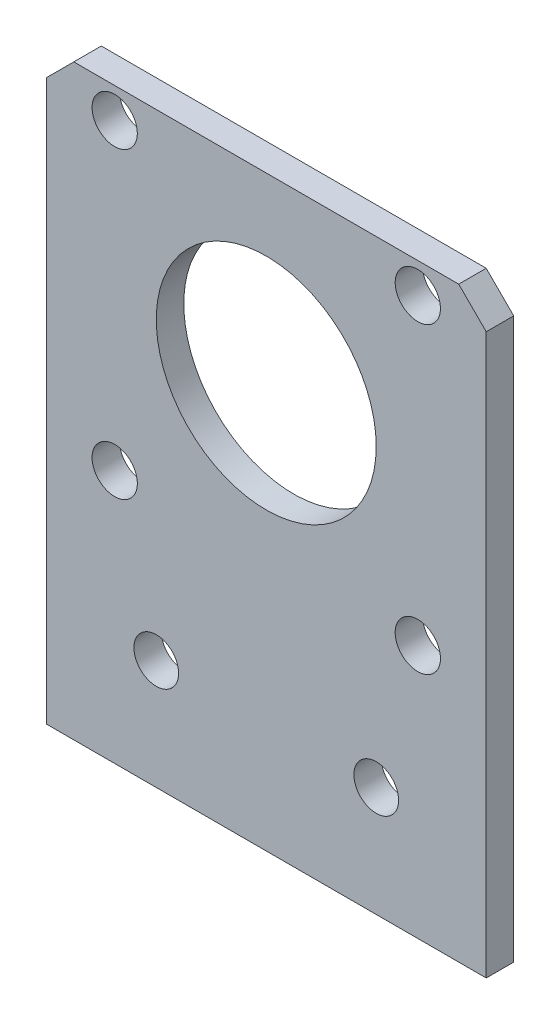
ISO-10303-21;
HEADER;
FILE_DESCRIPTION(('STEP AP214'),'2;1');
FILE_NAME('part.step','',(''),(''),'','','');
FILE_SCHEMA(('AUTOMOTIVE_DESIGN { 1 0 10303 214 1 1 1 1 }'));
ENDSEC;
DATA;
#1=APPLICATION_CONTEXT('core data for automotive mechanical design processes');
#2=APPLICATION_PROTOCOL_DEFINITION('international standard','automotive_design',2000,#1);
#3=PRODUCT_CONTEXT('',#1,'mechanical');
#4=PRODUCT('Part','Part','',(#3));
#5=PRODUCT_RELATED_PRODUCT_CATEGORY('part','',(#4));
#6=PRODUCT_DEFINITION_FORMATION('','',#4);
#7=PRODUCT_DEFINITION_CONTEXT('part definition',#1,'design');
#8=PRODUCT_DEFINITION('design','',#6,#7);
#9=PRODUCT_DEFINITION_SHAPE('','',#8);
#10=(LENGTH_UNIT() NAMED_UNIT(*) SI_UNIT(.MILLI.,.METRE.));
#11=(NAMED_UNIT(*) PLANE_ANGLE_UNIT() SI_UNIT($,.RADIAN.));
#12=(NAMED_UNIT(*) SI_UNIT($,.STERADIAN.) SOLID_ANGLE_UNIT());
#13=UNCERTAINTY_MEASURE_WITH_UNIT(LENGTH_MEASURE(1.E-05),#10,'distance_accuracy_value','');
#14=(GEOMETRIC_REPRESENTATION_CONTEXT(3) GLOBAL_UNCERTAINTY_ASSIGNED_CONTEXT((#13)) GLOBAL_UNIT_ASSIGNED_CONTEXT((#10,
#11,#12)) REPRESENTATION_CONTEXT('',''));
#15=CARTESIAN_POINT('',(0.,0.,0.));
#16=DIRECTION('',(0.,0.,1.));
#17=DIRECTION('',(1.,0.,0.));
#18=AXIS2_PLACEMENT_3D('',#15,#16,#17);
#19=CARTESIAN_POINT('',(0.,0.,3.175));
#20=DIRECTION('',(0.,0.,1.));
#21=DIRECTION('',(1.,0.,0.));
#22=AXIS2_PLACEMENT_3D('',#19,#20,#21);
#23=PLANE('',#22);
#24=CARTESIAN_POINT('',(-7.9,29.3,3.175));
#25=DIRECTION('',(0.,0.,1.));
#26=DIRECTION('',(1.,0.,0.));
#27=AXIS2_PLACEMENT_3D('',#24,#25,#26);
#28=CIRCLE('',#27,2.61299999999999);
#29=CARTESIAN_POINT('',(-5.28700000000002,29.3,3.175));
#30=VERTEX_POINT('',#29);
#31=EDGE_CURVE('E174',#30,#30,#28,.T.);
#32=ORIENTED_EDGE('',*,*,#31,.F.);
#33=EDGE_LOOP('',(#32));
#34=FACE_BOUND('',#33,.T.);
#35=CARTESIAN_POINT('',(-42.9,64.3,3.175));
#36=DIRECTION('',(0.,0.,1.));
#37=DIRECTION('',(1.,0.,0.));
#38=AXIS2_PLACEMENT_3D('',#35,#36,#37);
#39=CIRCLE('',#38,2.613);
#40=CARTESIAN_POINT('',(-40.287,64.3,3.175));
#41=VERTEX_POINT('',#40);
#42=EDGE_CURVE('E162',#41,#41,#39,.T.);
#43=ORIENTED_EDGE('',*,*,#42,.F.);
#44=EDGE_LOOP('',(#43));
#45=FACE_BOUND('',#44,.T.);
#46=CARTESIAN_POINT('',(-12.7,12.7,3.175));
#47=DIRECTION('',(0.,0.,1.));
#48=DIRECTION('',(-1.,0.,0.));
#49=AXIS2_PLACEMENT_3D('',#46,#47,#48);
#50=CIRCLE('',#49,2.58125);
#51=CARTESIAN_POINT('',(-15.28125,12.7,3.175));
#52=VERTEX_POINT('',#51);
#53=EDGE_CURVE('E150',#52,#52,#50,.T.);
#54=ORIENTED_EDGE('',*,*,#53,.F.);
#55=EDGE_LOOP('',(#54));
#56=FACE_BOUND('',#55,.T.);
#57=DIRECTION('',(0.,1.,0.));
#58=VECTOR('',#57,1.);
#59=CARTESIAN_POINT('',(0.,0.,3.175));
#60=LINE('',#59,#58);
#61=CARTESIAN_POINT('',(0.,0.,3.175));
#62=VERTEX_POINT('',#61);
#63=CARTESIAN_POINT('',(0.,64.625,3.175));
#64=VERTEX_POINT('',#63);
#65=EDGE_CURVE('E120',#62,#64,#60,.T.);
#66=ORIENTED_EDGE('',*,*,#65,.T.);
#67=DIRECTION('',(0.707106781186546,-0.707106781186549,0.));
#68=VECTOR('',#67,1.);
#69=CARTESIAN_POINT('',(32.3125,32.3124999999999,3.175));
#70=LINE('',#69,#68);
#71=CARTESIAN_POINT('',(-3.17500000000001,67.8,3.175));
#72=VERTEX_POINT('',#71);
#73=EDGE_CURVE('E41',#64,#72,#70,.F.);
#74=ORIENTED_EDGE('',*,*,#73,.T.);
#75=DIRECTION('',(-1.,0.,0.));
#76=VECTOR('',#75,1.);
#77=CARTESIAN_POINT('',(0.,67.8,3.175));
#78=LINE('',#77,#76);
#79=CARTESIAN_POINT('',(-47.625,67.8,3.175));
#80=VERTEX_POINT('',#79);
#81=EDGE_CURVE('E94',#72,#80,#78,.T.);
#82=ORIENTED_EDGE('',*,*,#81,.T.);
#83=DIRECTION('',(0.70710678118655,0.707106781186545,0.));
#84=VECTOR('',#83,1.);
#85=CARTESIAN_POINT('',(-57.7124999999998,57.7125000000002,3.175));
#86=LINE('',#85,#84);
#87=CARTESIAN_POINT('',(-50.8,64.625,3.175));
#88=VERTEX_POINT('',#87);
#89=EDGE_CURVE('E48',#80,#88,#86,.F.);
#90=ORIENTED_EDGE('',*,*,#89,.T.);
#91=DIRECTION('',(0.,-1.,0.));
#92=VECTOR('',#91,1.);
#93=CARTESIAN_POINT('',(-50.8,0.,3.175));
#94=LINE('',#93,#92);
#95=CARTESIAN_POINT('',(-50.8,0.,3.175));
#96=VERTEX_POINT('',#95);
#97=EDGE_CURVE('E86',#88,#96,#94,.T.);
#98=ORIENTED_EDGE('',*,*,#97,.T.);
#99=DIRECTION('',(1.,0.,0.));
#100=VECTOR('',#99,1.);
#101=CARTESIAN_POINT('',(0.,0.,3.175));
#102=LINE('',#101,#100);
#103=EDGE_CURVE('E90',#96,#62,#102,.T.);
#104=ORIENTED_EDGE('',*,*,#103,.T.);
#105=EDGE_LOOP('',(#66,#74,#82,#90,#98,#104));
#106=FACE_BOUND('',#105,.T.);
#107=CARTESIAN_POINT('',(-38.1,12.7,3.175));
#108=DIRECTION('',(0.,0.,1.));
#109=DIRECTION('',(1.,0.,0.));
#110=AXIS2_PLACEMENT_3D('',#107,#108,#109);
#111=CIRCLE('',#110,2.58125);
#112=CARTESIAN_POINT('',(-35.51875,12.7,3.175));
#113=VERTEX_POINT('',#112);
#114=EDGE_CURVE('E115',#113,#113,#111,.T.);
#115=ORIENTED_EDGE('',*,*,#114,.F.);
#116=EDGE_LOOP('',(#115));
#117=FACE_BOUND('',#116,.T.);
#118=CARTESIAN_POINT('',(-25.4,46.8,3.175));
#119=DIRECTION('',(0.,0.,1.));
#120=DIRECTION('',(1.,0.,0.));
#121=AXIS2_PLACEMENT_3D('',#118,#119,#120);
#122=CIRCLE('',#121,12.7);
#123=CARTESIAN_POINT('',(-12.7,46.8,3.175));
#124=VERTEX_POINT('',#123);
#125=EDGE_CURVE('E156',#124,#124,#122,.T.);
#126=ORIENTED_EDGE('',*,*,#125,.F.);
#127=EDGE_LOOP('',(#126));
#128=FACE_BOUND('',#127,.T.);
#129=CARTESIAN_POINT('',(-7.9,64.3,3.175));
#130=DIRECTION('',(0.,0.,1.));
#131=DIRECTION('',(-1.,0.,0.));
#132=AXIS2_PLACEMENT_3D('',#129,#130,#131);
#133=CIRCLE('',#132,2.61299999999999);
#134=CARTESIAN_POINT('',(-10.513,64.3,3.175));
#135=VERTEX_POINT('',#134);
#136=EDGE_CURVE('E168',#135,#135,#133,.T.);
#137=ORIENTED_EDGE('',*,*,#136,.F.);
#138=EDGE_LOOP('',(#137));
#139=FACE_BOUND('',#138,.T.);
#140=CARTESIAN_POINT('',(-42.9,29.3,3.175));
#141=DIRECTION('',(0.,0.,1.));
#142=DIRECTION('',(-1.,0.,0.));
#143=AXIS2_PLACEMENT_3D('',#140,#141,#142);
#144=CIRCLE('',#143,2.613);
#145=CARTESIAN_POINT('',(-45.513,29.3,3.175));
#146=VERTEX_POINT('',#145);
#147=EDGE_CURVE('E180',#146,#146,#144,.T.);
#148=ORIENTED_EDGE('',*,*,#147,.F.);
#149=EDGE_LOOP('',(#148));
#150=FACE_BOUND('',#149,.T.);
#151=ADVANCED_FACE('F33',(#34,#45,#56,#106,#117,#128,#139,#150),#23,.T.);
#152=CARTESIAN_POINT('',(0.,0.,0.));
#153=DIRECTION('',(0.,0.,1.));
#154=DIRECTION('',(1.,0.,0.));
#155=AXIS2_PLACEMENT_3D('',#152,#153,#154);
#156=PLANE('',#155);
#157=DIRECTION('',(-1.,0.,0.));
#158=VECTOR('',#157,1.);
#159=CARTESIAN_POINT('',(0.,67.8,0.));
#160=LINE('',#159,#158);
#161=CARTESIAN_POINT('',(-3.175,67.8,0.));
#162=VERTEX_POINT('',#161);
#163=CARTESIAN_POINT('',(-47.625,67.8,0.));
#164=VERTEX_POINT('',#163);
#165=EDGE_CURVE('E114',#162,#164,#160,.T.);
#166=ORIENTED_EDGE('',*,*,#165,.F.);
#167=DIRECTION('',(-0.707106781186546,0.707106781186549,0.));
#168=VECTOR('',#167,1.);
#169=CARTESIAN_POINT('',(-3.175,67.8,0.));
#170=LINE('',#169,#168);
#171=CARTESIAN_POINT('',(0.,64.625,0.));
#172=VERTEX_POINT('',#171);
#173=EDGE_CURVE('E128',#162,#172,#170,.F.);
#174=ORIENTED_EDGE('',*,*,#173,.T.);
#175=DIRECTION('',(0.,1.,0.));
#176=VECTOR('',#175,1.);
#177=CARTESIAN_POINT('',(0.,0.,0.));
#178=LINE('',#177,#176);
#179=CARTESIAN_POINT('',(0.,0.,0.));
#180=VERTEX_POINT('',#179);
#181=EDGE_CURVE('E112',#180,#172,#178,.T.);
#182=ORIENTED_EDGE('',*,*,#181,.F.);
#183=DIRECTION('',(1.,0.,0.));
#184=VECTOR('',#183,1.);
#185=CARTESIAN_POINT('',(0.,0.,0.));
#186=LINE('',#185,#184);
#187=CARTESIAN_POINT('',(-50.8,0.,0.));
#188=VERTEX_POINT('',#187);
#189=EDGE_CURVE('E119',#188,#180,#186,.T.);
#190=ORIENTED_EDGE('',*,*,#189,.F.);
#191=DIRECTION('',(0.,-1.,0.));
#192=VECTOR('',#191,1.);
#193=CARTESIAN_POINT('',(-50.8,0.,0.));
#194=LINE('',#193,#192);
#195=CARTESIAN_POINT('',(-50.8,64.625,0.));
#196=VERTEX_POINT('',#195);
#197=EDGE_CURVE('E100',#196,#188,#194,.T.);
#198=ORIENTED_EDGE('',*,*,#197,.F.);
#199=DIRECTION('',(-0.70710678118655,-0.707106781186545,0.));
#200=VECTOR('',#199,1.);
#201=CARTESIAN_POINT('',(-50.8,64.625,0.));
#202=LINE('',#201,#200);
#203=EDGE_CURVE('E126',#196,#164,#202,.F.);
#204=ORIENTED_EDGE('',*,*,#203,.T.);
#205=EDGE_LOOP('',(#166,#174,#182,#190,#198,#204));
#206=FACE_BOUND('',#205,.T.);
#207=CARTESIAN_POINT('',(-38.1,12.7,0.));
#208=DIRECTION('',(0.,0.,1.));
#209=DIRECTION('',(1.,0.,0.));
#210=AXIS2_PLACEMENT_3D('',#207,#208,#209);
#211=CIRCLE('',#210,2.58125);
#212=CARTESIAN_POINT('',(-35.51875,12.7,0.));
#213=VERTEX_POINT('',#212);
#214=EDGE_CURVE('E147',#213,#213,#211,.T.);
#215=ORIENTED_EDGE('',*,*,#214,.T.);
#216=EDGE_LOOP('',(#215));
#217=FACE_BOUND('',#216,.T.);
#218=CARTESIAN_POINT('',(-12.7,12.7,0.));
#219=DIRECTION('',(0.,0.,1.));
#220=DIRECTION('',(-1.,0.,0.));
#221=AXIS2_PLACEMENT_3D('',#218,#219,#220);
#222=CIRCLE('',#221,2.58125);
#223=CARTESIAN_POINT('',(-15.28125,12.7,0.));
#224=VERTEX_POINT('',#223);
#225=EDGE_CURVE('E153',#224,#224,#222,.T.);
#226=ORIENTED_EDGE('',*,*,#225,.T.);
#227=EDGE_LOOP('',(#226));
#228=FACE_BOUND('',#227,.T.);
#229=CARTESIAN_POINT('',(-25.4,46.8,0.));
#230=DIRECTION('',(0.,0.,1.));
#231=DIRECTION('',(1.,0.,0.));
#232=AXIS2_PLACEMENT_3D('',#229,#230,#231);
#233=CIRCLE('',#232,12.7);
#234=CARTESIAN_POINT('',(-12.7,46.8,0.));
#235=VERTEX_POINT('',#234);
#236=EDGE_CURVE('E159',#235,#235,#233,.T.);
#237=ORIENTED_EDGE('',*,*,#236,.T.);
#238=EDGE_LOOP('',(#237));
#239=FACE_BOUND('',#238,.T.);
#240=CARTESIAN_POINT('',(-42.9,64.3,0.));
#241=DIRECTION('',(0.,0.,1.));
#242=DIRECTION('',(1.,0.,0.));
#243=AXIS2_PLACEMENT_3D('',#240,#241,#242);
#244=CIRCLE('',#243,2.613);
#245=CARTESIAN_POINT('',(-40.287,64.3,0.));
#246=VERTEX_POINT('',#245);
#247=EDGE_CURVE('E165',#246,#246,#244,.T.);
#248=ORIENTED_EDGE('',*,*,#247,.T.);
#249=EDGE_LOOP('',(#248));
#250=FACE_BOUND('',#249,.T.);
#251=CARTESIAN_POINT('',(-7.9,64.3,0.));
#252=DIRECTION('',(0.,0.,1.));
#253=DIRECTION('',(-1.,0.,0.));
#254=AXIS2_PLACEMENT_3D('',#251,#252,#253);
#255=CIRCLE('',#254,2.61299999999999);
#256=CARTESIAN_POINT('',(-10.513,64.3,0.));
#257=VERTEX_POINT('',#256);
#258=EDGE_CURVE('E171',#257,#257,#255,.T.);
#259=ORIENTED_EDGE('',*,*,#258,.T.);
#260=EDGE_LOOP('',(#259));
#261=FACE_BOUND('',#260,.T.);
#262=CARTESIAN_POINT('',(-7.9,29.3,0.));
#263=DIRECTION('',(0.,0.,1.));
#264=DIRECTION('',(1.,0.,0.));
#265=AXIS2_PLACEMENT_3D('',#262,#263,#264);
#266=CIRCLE('',#265,2.61299999999999);
#267=CARTESIAN_POINT('',(-5.28700000000002,29.3,0.));
#268=VERTEX_POINT('',#267);
#269=EDGE_CURVE('E177',#268,#268,#266,.T.);
#270=ORIENTED_EDGE('',*,*,#269,.T.);
#271=EDGE_LOOP('',(#270));
#272=FACE_BOUND('',#271,.T.);
#273=CARTESIAN_POINT('',(-42.9,29.3,0.));
#274=DIRECTION('',(0.,0.,1.));
#275=DIRECTION('',(-1.,0.,0.));
#276=AXIS2_PLACEMENT_3D('',#273,#274,#275);
#277=CIRCLE('',#276,2.613);
#278=CARTESIAN_POINT('',(-45.513,29.3,0.));
#279=VERTEX_POINT('',#278);
#280=EDGE_CURVE('E183',#279,#279,#277,.T.);
#281=ORIENTED_EDGE('',*,*,#280,.T.);
#282=EDGE_LOOP('',(#281));
#283=FACE_BOUND('',#282,.T.);
#284=ADVANCED_FACE('F142',(#206,#217,#228,#239,#250,#261,#272,#283),#156,.F.);
#285=CARTESIAN_POINT('',(0.,0.,3.175));
#286=DIRECTION('',(-1.,0.,0.));
#287=DIRECTION('',(0.,0.,1.));
#288=AXIS2_PLACEMENT_3D('',#285,#286,#287);
#289=PLANE('',#288);
#290=ORIENTED_EDGE('',*,*,#181,.T.);
#291=DIRECTION('',(0.,0.,1.));
#292=VECTOR('',#291,1.);
#293=CARTESIAN_POINT('',(0.,64.625,3.175));
#294=LINE('',#293,#292);
#295=EDGE_CURVE('E56',#172,#64,#294,.T.);
#296=ORIENTED_EDGE('',*,*,#295,.T.);
#297=ORIENTED_EDGE('',*,*,#65,.F.);
#298=DIRECTION('',(0.,0.,-1.));
#299=VECTOR('',#298,1.);
#300=CARTESIAN_POINT('',(0.,0.,3.175));
#301=LINE('',#300,#299);
#302=EDGE_CURVE('E104',#62,#180,#301,.T.);
#303=ORIENTED_EDGE('',*,*,#302,.T.);
#304=EDGE_LOOP('',(#290,#296,#297,#303));
#305=FACE_BOUND('',#304,.T.);
#306=ADVANCED_FACE('F144',(#305),#289,.F.);
#307=CARTESIAN_POINT('',(0.,67.8,3.175));
#308=DIRECTION('',(0.,-1.,0.));
#309=DIRECTION('',(0.,0.,-1.));
#310=AXIS2_PLACEMENT_3D('',#307,#308,#309);
#311=PLANE('',#310);
#312=ORIENTED_EDGE('',*,*,#81,.F.);
#313=DIRECTION('',(0.,0.,-1.));
#314=VECTOR('',#313,1.);
#315=CARTESIAN_POINT('',(-3.175,67.8,3.175));
#316=LINE('',#315,#314);
#317=EDGE_CURVE('E123',#72,#162,#316,.T.);
#318=ORIENTED_EDGE('',*,*,#317,.T.);
#319=ORIENTED_EDGE('',*,*,#165,.T.);
#320=DIRECTION('',(0.,0.,1.));
#321=VECTOR('',#320,1.);
#322=CARTESIAN_POINT('',(-47.625,67.8,3.175));
#323=LINE('',#322,#321);
#324=EDGE_CURVE('E103',#164,#80,#323,.T.);
#325=ORIENTED_EDGE('',*,*,#324,.T.);
#326=EDGE_LOOP('',(#312,#318,#319,#325));
#327=FACE_BOUND('',#326,.T.);
#328=ADVANCED_FACE('F136',(#327),#311,.F.);
#329=CARTESIAN_POINT('',(-50.8,0.,3.175));
#330=DIRECTION('',(1.,0.,0.));
#331=DIRECTION('',(0.,0.,-1.));
#332=AXIS2_PLACEMENT_3D('',#329,#330,#331);
#333=PLANE('',#332);
#334=ORIENTED_EDGE('',*,*,#97,.F.);
#335=DIRECTION('',(0.,0.,-1.));
#336=VECTOR('',#335,1.);
#337=CARTESIAN_POINT('',(-50.8,64.625,3.175));
#338=LINE('',#337,#336);
#339=EDGE_CURVE('E11',#88,#196,#338,.T.);
#340=ORIENTED_EDGE('',*,*,#339,.T.);
#341=ORIENTED_EDGE('',*,*,#197,.T.);
#342=DIRECTION('',(0.,0.,-1.));
#343=VECTOR('',#342,1.);
#344=CARTESIAN_POINT('',(-50.8,0.,3.175));
#345=LINE('',#344,#343);
#346=EDGE_CURVE('E97',#96,#188,#345,.T.);
#347=ORIENTED_EDGE('',*,*,#346,.F.);
#348=EDGE_LOOP('',(#334,#340,#341,#347));
#349=FACE_BOUND('',#348,.T.);
#350=ADVANCED_FACE('F98',(#349),#333,.F.);
#351=CARTESIAN_POINT('',(0.,0.,3.175));
#352=DIRECTION('',(0.,1.,0.));
#353=DIRECTION('',(0.,0.,1.));
#354=AXIS2_PLACEMENT_3D('',#351,#352,#353);
#355=PLANE('',#354);
#356=ORIENTED_EDGE('',*,*,#189,.T.);
#357=ORIENTED_EDGE('',*,*,#302,.F.);
#358=ORIENTED_EDGE('',*,*,#103,.F.);
#359=ORIENTED_EDGE('',*,*,#346,.T.);
#360=EDGE_LOOP('',(#356,#357,#358,#359));
#361=FACE_BOUND('',#360,.T.);
#362=ADVANCED_FACE('F106',(#361),#355,.F.);
#363=CARTESIAN_POINT('',(-38.1,12.7,3.175));
#364=DIRECTION('',(0.,0.,-1.));
#365=DIRECTION('',(-1.,0.,0.));
#366=AXIS2_PLACEMENT_3D('',#363,#364,#365);
#367=CYLINDRICAL_SURFACE('',#366,2.58125);
#368=ORIENTED_EDGE('',*,*,#114,.T.);
#369=EDGE_LOOP('',(#368));
#370=FACE_BOUND('',#369,.T.);
#371=ORIENTED_EDGE('',*,*,#214,.F.);
#372=EDGE_LOOP('',(#371));
#373=FACE_BOUND('',#372,.T.);
#374=ADVANCED_FACE('F202',(#370,#373),#367,.F.);
#375=CARTESIAN_POINT('',(-12.7,12.7,3.175));
#376=DIRECTION('',(0.,0.,-1.));
#377=DIRECTION('',(-1.,0.,0.));
#378=AXIS2_PLACEMENT_3D('',#375,#376,#377);
#379=CYLINDRICAL_SURFACE('',#378,2.58125);
#380=ORIENTED_EDGE('',*,*,#53,.T.);
#381=EDGE_LOOP('',(#380));
#382=FACE_BOUND('',#381,.T.);
#383=ORIENTED_EDGE('',*,*,#225,.F.);
#384=EDGE_LOOP('',(#383));
#385=FACE_BOUND('',#384,.T.);
#386=ADVANCED_FACE('F236',(#382,#385),#379,.F.);
#387=CARTESIAN_POINT('',(-25.4,46.8,3.175));
#388=DIRECTION('',(0.,0.,-1.));
#389=DIRECTION('',(-1.,0.,0.));
#390=AXIS2_PLACEMENT_3D('',#387,#388,#389);
#391=CYLINDRICAL_SURFACE('',#390,12.7);
#392=ORIENTED_EDGE('',*,*,#125,.T.);
#393=EDGE_LOOP('',(#392));
#394=FACE_BOUND('',#393,.T.);
#395=ORIENTED_EDGE('',*,*,#236,.F.);
#396=EDGE_LOOP('',(#395));
#397=FACE_BOUND('',#396,.T.);
#398=ADVANCED_FACE('F233',(#394,#397),#391,.F.);
#399=CARTESIAN_POINT('',(-42.9,64.3,3.175));
#400=DIRECTION('',(0.,0.,-1.));
#401=DIRECTION('',(-1.,0.,0.));
#402=AXIS2_PLACEMENT_3D('',#399,#400,#401);
#403=CYLINDRICAL_SURFACE('',#402,2.613);
#404=ORIENTED_EDGE('',*,*,#42,.T.);
#405=EDGE_LOOP('',(#404));
#406=FACE_BOUND('',#405,.T.);
#407=ORIENTED_EDGE('',*,*,#247,.F.);
#408=EDGE_LOOP('',(#407));
#409=FACE_BOUND('',#408,.T.);
#410=ADVANCED_FACE('F229',(#406,#409),#403,.F.);
#411=CARTESIAN_POINT('',(-7.9,64.3,3.175));
#412=DIRECTION('',(0.,0.,-1.));
#413=DIRECTION('',(-1.,0.,0.));
#414=AXIS2_PLACEMENT_3D('',#411,#412,#413);
#415=CYLINDRICAL_SURFACE('',#414,2.61299999999999);
#416=ORIENTED_EDGE('',*,*,#136,.T.);
#417=EDGE_LOOP('',(#416));
#418=FACE_BOUND('',#417,.T.);
#419=ORIENTED_EDGE('',*,*,#258,.F.);
#420=EDGE_LOOP('',(#419));
#421=FACE_BOUND('',#420,.T.);
#422=ADVANCED_FACE('F223',(#418,#421),#415,.F.);
#423=CARTESIAN_POINT('',(-7.9,29.3,3.175));
#424=DIRECTION('',(0.,0.,-1.));
#425=DIRECTION('',(-1.,0.,0.));
#426=AXIS2_PLACEMENT_3D('',#423,#424,#425);
#427=CYLINDRICAL_SURFACE('',#426,2.61299999999999);
#428=ORIENTED_EDGE('',*,*,#31,.T.);
#429=EDGE_LOOP('',(#428));
#430=FACE_BOUND('',#429,.T.);
#431=ORIENTED_EDGE('',*,*,#269,.F.);
#432=EDGE_LOOP('',(#431));
#433=FACE_BOUND('',#432,.T.);
#434=ADVANCED_FACE('F218',(#430,#433),#427,.F.);
#435=CARTESIAN_POINT('',(-42.9,29.3,3.175));
#436=DIRECTION('',(0.,0.,-1.));
#437=DIRECTION('',(-1.,0.,0.));
#438=AXIS2_PLACEMENT_3D('',#435,#436,#437);
#439=CYLINDRICAL_SURFACE('',#438,2.613);
#440=ORIENTED_EDGE('',*,*,#147,.T.);
#441=EDGE_LOOP('',(#440));
#442=FACE_BOUND('',#441,.T.);
#443=ORIENTED_EDGE('',*,*,#280,.F.);
#444=EDGE_LOOP('',(#443));
#445=FACE_BOUND('',#444,.T.);
#446=ADVANCED_FACE('F189',(#442,#445),#439,.F.);
#447=CARTESIAN_POINT('',(-3.175,67.8,3.175));
#448=DIRECTION('',(-0.707106781186549,-0.707106781186546,0.));
#449=DIRECTION('',(0.,0.,-1.));
#450=AXIS2_PLACEMENT_3D('',#447,#448,#449);
#451=PLANE('',#450);
#452=ORIENTED_EDGE('',*,*,#73,.F.);
#453=ORIENTED_EDGE('',*,*,#295,.F.);
#454=ORIENTED_EDGE('',*,*,#173,.F.);
#455=ORIENTED_EDGE('',*,*,#317,.F.);
#456=EDGE_LOOP('',(#452,#453,#454,#455));
#457=FACE_BOUND('',#456,.T.);
#458=ADVANCED_FACE('F139',(#457),#451,.F.);
#459=CARTESIAN_POINT('',(-50.8,64.625,3.175));
#460=DIRECTION('',(0.707106781186545,-0.70710678118655,0.));
#461=DIRECTION('',(0.,0.,-1.));
#462=AXIS2_PLACEMENT_3D('',#459,#460,#461);
#463=PLANE('',#462);
#464=ORIENTED_EDGE('',*,*,#89,.F.);
#465=ORIENTED_EDGE('',*,*,#324,.F.);
#466=ORIENTED_EDGE('',*,*,#203,.F.);
#467=ORIENTED_EDGE('',*,*,#339,.F.);
#468=EDGE_LOOP('',(#464,#465,#466,#467));
#469=FACE_BOUND('',#468,.T.);
#470=ADVANCED_FACE('F35',(#469),#463,.F.);
#471=CLOSED_SHELL('',(#151,#284,#306,#328,#350,#362,#374,#386,#398,#410,#422,#434,#446,#458,#470));
#472=MANIFOLD_SOLID_BREP('B2',#471);
#473=ADVANCED_BREP_SHAPE_REPRESENTATION('',(#18,#472),#14);
#474=SHAPE_DEFINITION_REPRESENTATION(#9,#473);
ENDSEC;
END-ISO-10303-21;
